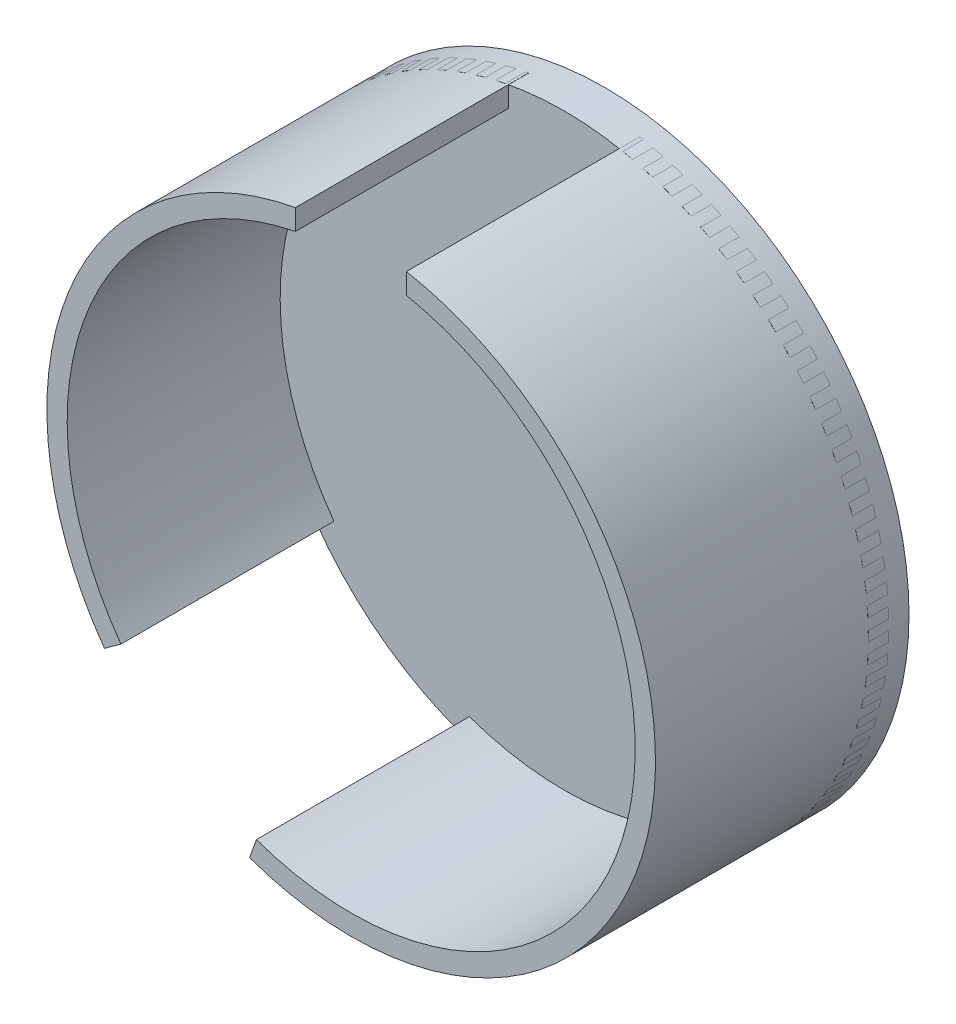
ISO-10303-21;
HEADER;
FILE_DESCRIPTION(('STEP AP214'),'2;1');
FILE_NAME('part.step','',(''),(''),'','','');
FILE_SCHEMA(('AUTOMOTIVE_DESIGN { 1 0 10303 214 1 1 1 1 }'));
ENDSEC;
DATA;
#1=APPLICATION_CONTEXT('core data for automotive mechanical design processes');
#2=APPLICATION_PROTOCOL_DEFINITION('international standard','automotive_design',2000,#1);
#3=PRODUCT_CONTEXT('',#1,'mechanical');
#4=PRODUCT('Part','Part','',(#3));
#5=PRODUCT_RELATED_PRODUCT_CATEGORY('part','',(#4));
#6=PRODUCT_DEFINITION_FORMATION('','',#4);
#7=PRODUCT_DEFINITION_CONTEXT('part definition',#1,'design');
#8=PRODUCT_DEFINITION('design','',#6,#7);
#9=PRODUCT_DEFINITION_SHAPE('','',#8);
#10=(LENGTH_UNIT() NAMED_UNIT(*) SI_UNIT(.MILLI.,.METRE.));
#11=(NAMED_UNIT(*) PLANE_ANGLE_UNIT() SI_UNIT($,.RADIAN.));
#12=(NAMED_UNIT(*) SI_UNIT($,.STERADIAN.) SOLID_ANGLE_UNIT());
#13=UNCERTAINTY_MEASURE_WITH_UNIT(LENGTH_MEASURE(1.E-05),#10,'distance_accuracy_value','');
#14=(GEOMETRIC_REPRESENTATION_CONTEXT(3) GLOBAL_UNCERTAINTY_ASSIGNED_CONTEXT((#13)) GLOBAL_UNIT_ASSIGNED_CONTEXT((#10,
#11,#12)) REPRESENTATION_CONTEXT('',''));
#15=CARTESIAN_POINT('',(0.,0.,0.));
#16=DIRECTION('',(0.,0.,1.));
#17=DIRECTION('',(1.,0.,0.));
#18=AXIS2_PLACEMENT_3D('',#15,#16,#17);
#19=CARTESIAN_POINT('',(-32.9682085133082,83.708055005863,37.0037453271887));
#20=DIRECTION('',(0.,0.,-1.));
#21=DIRECTION('',(-1.,0.,0.));
#22=AXIS2_PLACEMENT_3D('',#19,#20,#21);
#23=CYLINDRICAL_SURFACE('',#22,30.);
#24=CARTESIAN_POINT('',(-32.9682085133082,83.708055005863,37.0037453271887));
#25=DIRECTION('',(0.,0.,1.));
#26=DIRECTION('',(1.,0.,0.));
#27=AXIS2_PLACEMENT_3D('',#24,#25,#26);
#28=CIRCLE('',#27,30.);
#29=CARTESIAN_POINT('',(-2.9682085133082,83.708055005863,37.0037453271887));
#30=VERTEX_POINT('',#29);
#31=EDGE_CURVE('P0_E10',#30,#30,#28,.T.);
#32=ORIENTED_EDGE('',*,*,#31,.F.);
#33=EDGE_LOOP('',(#32));
#34=FACE_BOUND('',#33,.T.);
#35=CARTESIAN_POINT('',(-32.9682085133082,83.708055005863,33.002591514543));
#36=DIRECTION('',(0.,0.,1.));
#37=DIRECTION('',(1.,0.,0.));
#38=AXIS2_PLACEMENT_3D('',#35,#36,#37);
#39=CIRCLE('',#38,30.);
#40=CARTESIAN_POINT('',(-2.9682085133082,83.708055005863,33.002591514543));
#41=VERTEX_POINT('',#40);
#42=EDGE_CURVE('P0_E18',#41,#41,#39,.T.);
#43=ORIENTED_EDGE('',*,*,#42,.T.);
#44=EDGE_LOOP('',(#43));
#45=FACE_BOUND('',#44,.T.);
#46=ADVANCED_FACE('P0_F15',(#34,#45),#23,.T.);
#47=CARTESIAN_POINT('',(-32.9682085133082,83.708055005863,37.0037453271887));
#48=DIRECTION('',(0.,0.,1.));
#49=DIRECTION('',(1.,0.,0.));
#50=AXIS2_PLACEMENT_3D('',#47,#48,#49);
#51=PLANE('',#50);
#52=ORIENTED_EDGE('',*,*,#31,.T.);
#53=EDGE_LOOP('',(#52));
#54=FACE_BOUND('',#53,.T.);
#55=ADVANCED_FACE('P0_F30',(#54),#51,.T.);
#56=CARTESIAN_POINT('',(-32.9682085133082,83.708055005863,33.002591514543));
#57=DIRECTION('',(0.,0.,1.));
#58=DIRECTION('',(1.,0.,0.));
#59=AXIS2_PLACEMENT_3D('',#56,#57,#58);
#60=PLANE('',#59);
#61=ORIENTED_EDGE('',*,*,#42,.F.);
#62=EDGE_LOOP('',(#61));
#63=FACE_BOUND('',#62,.T.);
#64=ADVANCED_FACE('P0_F28',(#63),#60,.F.);
#65=CLOSED_SHELL('',(#46,#55,#64));
#66=MANIFOLD_SOLID_BREP('P0_B1',#65);
#67=CARTESIAN_POINT('',(-32.9682085133082,83.708055005863,58.002591514543));
#68=DIRECTION('',(0.,0.,-1.));
#69=DIRECTION('',(-1.,0.,0.));
#70=AXIS2_PLACEMENT_3D('',#67,#68,#69);
#71=CYLINDRICAL_SURFACE('',#70,28.);
#72=CARTESIAN_POINT('',(-32.9682085133082,83.708055005863,35.002591514543));
#73=DIRECTION('',(0.,0.,-1.));
#74=DIRECTION('',(1.,0.,0.));
#75=AXIS2_PLACEMENT_3D('',#72,#73,#74);
#76=CIRCLE('',#75,28.);
#77=CARTESIAN_POINT('',(-55.6726774433688,67.3218690370687,35.002591514543));
#78=VERTEX_POINT('',#77);
#79=CARTESIAN_POINT('',(-38.4682085133082,111.162562832448,35.002591514543));
#80=VERTEX_POINT('',#79);
#81=EDGE_CURVE('P1_E79',#78,#80,#76,.T.);
#82=ORIENTED_EDGE('',*,*,#81,.T.);
#83=DIRECTION('',(0.,0.,-1.));
#84=VECTOR('',#83,1.);
#85=CARTESIAN_POINT('',(-38.4682085133082,111.162562832448,58.002591514543));
#86=LINE('',#85,#84);
#87=CARTESIAN_POINT('',(-38.4682085133082,111.162562832448,58.002591514543));
#88=VERTEX_POINT('',#87);
#89=EDGE_CURVE('P1_E10',#88,#80,#86,.T.);
#90=ORIENTED_EDGE('',*,*,#89,.F.);
#91=CARTESIAN_POINT('',(-32.9682085133082,83.708055005863,58.002591514543));
#92=DIRECTION('',(0.,0.,-1.));
#93=DIRECTION('',(1.,0.,0.));
#94=AXIS2_PLACEMENT_3D('',#91,#92,#93);
#95=CIRCLE('',#94,28.);
#96=CARTESIAN_POINT('',(-55.6726774433688,67.3218690370687,58.002591514543));
#97=VERTEX_POINT('',#96);
#98=EDGE_CURVE('P1_E67',#97,#88,#95,.T.);
#99=ORIENTED_EDGE('',*,*,#98,.F.);
#100=DIRECTION('',(0.,0.,-1.));
#101=VECTOR('',#100,1.);
#102=CARTESIAN_POINT('',(-55.6726774433688,67.3218690370687,58.002591514543));
#103=LINE('',#102,#101);
#104=EDGE_CURVE('P1_E75',#97,#78,#103,.T.);
#105=ORIENTED_EDGE('',*,*,#104,.T.);
#106=EDGE_LOOP('',(#82,#90,#99,#105));
#107=FACE_BOUND('',#106,.T.);
#108=ADVANCED_FACE('P1_F16',(#107),#71,.F.);
#109=CARTESIAN_POINT('',(-38.4682085133082,113.19957921198,58.002591514543));
#110=DIRECTION('',(-1.,0.,0.));
#111=DIRECTION('',(0.,0.,1.));
#112=AXIS2_PLACEMENT_3D('',#109,#110,#111);
#113=PLANE('',#112);
#114=DIRECTION('',(0.,1.,0.));
#115=VECTOR('',#114,1.);
#116=CARTESIAN_POINT('',(-38.4682085133082,113.19957921198,35.002591514543));
#117=LINE('',#116,#115);
#118=CARTESIAN_POINT('',(-38.4682085133082,113.19957921198,35.002591514543));
#119=VERTEX_POINT('',#118);
#120=EDGE_CURVE('P1_E71',#80,#119,#117,.T.);
#121=ORIENTED_EDGE('',*,*,#120,.T.);
#122=DIRECTION('',(0.,0.,-1.));
#123=VECTOR('',#122,1.);
#124=CARTESIAN_POINT('',(-38.4682085133082,113.19957921198,58.002591514543));
#125=LINE('',#124,#123);
#126=CARTESIAN_POINT('',(-38.4682085133082,113.19957921198,58.002591514543));
#127=VERTEX_POINT('',#126);
#128=EDGE_CURVE('P1_E24',#127,#119,#125,.T.);
#129=ORIENTED_EDGE('',*,*,#128,.F.);
#130=DIRECTION('',(0.,1.,0.));
#131=VECTOR('',#130,1.);
#132=CARTESIAN_POINT('',(-38.4682085133082,113.19957921198,58.002591514543));
#133=LINE('',#132,#131);
#134=EDGE_CURVE('P1_E62',#88,#127,#133,.T.);
#135=ORIENTED_EDGE('',*,*,#134,.F.);
#136=ORIENTED_EDGE('',*,*,#89,.T.);
#137=EDGE_LOOP('',(#121,#129,#135,#136));
#138=FACE_BOUND('',#137,.T.);
#139=ADVANCED_FACE('P1_F70',(#138),#113,.F.);
#140=CARTESIAN_POINT('',(-32.9682085133082,83.708055005863,58.002591514543));
#141=DIRECTION('',(0.,0.,-1.));
#142=DIRECTION('',(-1.,0.,0.));
#143=AXIS2_PLACEMENT_3D('',#140,#141,#142);
#144=CYLINDRICAL_SURFACE('',#143,30.);
#145=CARTESIAN_POINT('',(-32.9682085133082,83.708055005863,35.002591514543));
#146=DIRECTION('',(0.,0.,1.));
#147=DIRECTION('',(1.,0.,0.));
#148=AXIS2_PLACEMENT_3D('',#145,#146,#147);
#149=CIRCLE('',#148,30.);
#150=CARTESIAN_POINT('',(-57.2944252240874,66.1514271821548,35.002591514543));
#151=VERTEX_POINT('',#150);
#152=EDGE_CURVE('P1_E49',#119,#151,#149,.T.);
#153=ORIENTED_EDGE('',*,*,#152,.T.);
#154=DIRECTION('',(0.,0.,-1.));
#155=VECTOR('',#154,1.);
#156=CARTESIAN_POINT('',(-57.2944252240874,66.1514271821548,58.002591514543));
#157=LINE('',#156,#155);
#158=CARTESIAN_POINT('',(-57.2944252240874,66.1514271821548,58.002591514543));
#159=VERTEX_POINT('',#158);
#160=EDGE_CURVE('P1_E72',#159,#151,#157,.T.);
#161=ORIENTED_EDGE('',*,*,#160,.F.);
#162=CARTESIAN_POINT('',(-32.9682085133082,83.708055005863,58.002591514543));
#163=DIRECTION('',(0.,0.,1.));
#164=DIRECTION('',(1.,0.,0.));
#165=AXIS2_PLACEMENT_3D('',#162,#163,#164);
#166=CIRCLE('',#165,30.);
#167=EDGE_CURVE('P1_E65',#127,#159,#166,.T.);
#168=ORIENTED_EDGE('',*,*,#167,.F.);
#169=ORIENTED_EDGE('',*,*,#128,.T.);
#170=EDGE_LOOP('',(#153,#161,#168,#169));
#171=FACE_BOUND('',#170,.T.);
#172=ADVANCED_FACE('P1_F73',(#171),#144,.T.);
#173=CARTESIAN_POINT('',(-57.2944252240874,66.1514271821548,58.002591514543));
#174=DIRECTION('',(-0.58522092745694,0.810873890359308,0.));
#175=DIRECTION('',(-0.810873890359308,-0.58522092745694,0.));
#176=AXIS2_PLACEMENT_3D('',#173,#174,#175);
#177=PLANE('',#176);
#178=DIRECTION('',(0.810873890359308,0.58522092745694,0.));
#179=VECTOR('',#178,1.);
#180=CARTESIAN_POINT('',(-57.2944252240874,66.1514271821548,35.002591514543));
#181=LINE('',#180,#179);
#182=EDGE_CURVE('P1_E55',#151,#78,#181,.T.);
#183=ORIENTED_EDGE('',*,*,#182,.T.);
#184=ORIENTED_EDGE('',*,*,#104,.F.);
#185=DIRECTION('',(0.810873890359308,0.58522092745694,0.));
#186=VECTOR('',#185,1.);
#187=CARTESIAN_POINT('',(-57.2944252240874,66.1514271821548,58.002591514543));
#188=LINE('',#187,#186);
#189=EDGE_CURVE('P1_E32',#159,#97,#188,.T.);
#190=ORIENTED_EDGE('',*,*,#189,.F.);
#191=ORIENTED_EDGE('',*,*,#160,.T.);
#192=EDGE_LOOP('',(#183,#184,#190,#191));
#193=FACE_BOUND('',#192,.T.);
#194=ADVANCED_FACE('P1_F86',(#193),#177,.F.);
#195=CARTESIAN_POINT('',(-32.9682085133082,83.708055005863,58.002591514543));
#196=DIRECTION('',(0.,0.,1.));
#197=DIRECTION('',(1.,0.,0.));
#198=AXIS2_PLACEMENT_3D('',#195,#196,#197);
#199=PLANE('',#198);
#200=ORIENTED_EDGE('',*,*,#98,.T.);
#201=ORIENTED_EDGE('',*,*,#134,.T.);
#202=ORIENTED_EDGE('',*,*,#167,.T.);
#203=ORIENTED_EDGE('',*,*,#189,.T.);
#204=EDGE_LOOP('',(#200,#201,#202,#203));
#205=FACE_BOUND('',#204,.T.);
#206=ADVANCED_FACE('P1_F63',(#205),#199,.T.);
#207=CARTESIAN_POINT('',(-32.9682085133082,83.708055005863,35.002591514543));
#208=DIRECTION('',(0.,0.,1.));
#209=DIRECTION('',(1.,0.,0.));
#210=AXIS2_PLACEMENT_3D('',#207,#208,#209);
#211=PLANE('',#210);
#212=ORIENTED_EDGE('',*,*,#81,.F.);
#213=ORIENTED_EDGE('',*,*,#182,.F.);
#214=ORIENTED_EDGE('',*,*,#152,.F.);
#215=ORIENTED_EDGE('',*,*,#120,.F.);
#216=EDGE_LOOP('',(#212,#213,#214,#215));
#217=FACE_BOUND('',#216,.T.);
#218=ADVANCED_FACE('P1_F89',(#217),#211,.F.);
#219=CLOSED_SHELL('',(#108,#139,#172,#194,#206,#218));
#220=MANIFOLD_SOLID_BREP('P1_B1',#219);
#221=CARTESIAN_POINT('',(-32.9682085133082,83.708055005863,58.002591514543));
#222=DIRECTION('',(0.,0.,-1.));
#223=DIRECTION('',(-1.,0.,0.));
#224=AXIS2_PLACEMENT_3D('',#221,#222,#223);
#225=CYLINDRICAL_SURFACE('',#224,28.);
#226=CARTESIAN_POINT('',(-32.9682085133082,83.708055005863,35.002591514543));
#227=DIRECTION('',(0.,0.,-1.));
#228=DIRECTION('',(1.,0.,0.));
#229=AXIS2_PLACEMENT_3D('',#226,#227,#228);
#230=CIRCLE('',#229,28.);
#231=CARTESIAN_POINT('',(-27.5282449084881,111.174521760403,35.002591514543));
#232=VERTEX_POINT('',#231);
#233=CARTESIAN_POINT('',(-42.3145871575244,57.3140176822753,35.002591514543));
#234=VERTEX_POINT('',#233);
#235=EDGE_CURVE('P2_E80',#232,#234,#230,.T.);
#236=ORIENTED_EDGE('',*,*,#235,.T.);
#237=DIRECTION('',(0.,0.,-1.));
#238=VECTOR('',#237,1.);
#239=CARTESIAN_POINT('',(-42.3145871575244,57.3140176822753,58.002591514543));
#240=LINE('',#239,#238);
#241=CARTESIAN_POINT('',(-42.3145871575244,57.3140176822753,58.002591514543));
#242=VERTEX_POINT('',#241);
#243=EDGE_CURVE('P2_E11',#242,#234,#240,.T.);
#244=ORIENTED_EDGE('',*,*,#243,.F.);
#245=CARTESIAN_POINT('',(-32.9682085133082,83.708055005863,58.002591514543));
#246=DIRECTION('',(0.,0.,-1.));
#247=DIRECTION('',(1.,0.,0.));
#248=AXIS2_PLACEMENT_3D('',#245,#246,#247);
#249=CIRCLE('',#248,28.);
#250=CARTESIAN_POINT('',(-27.5282449084881,111.174521760403,58.002591514543));
#251=VERTEX_POINT('',#250);
#252=EDGE_CURVE('P2_E68',#251,#242,#249,.T.);
#253=ORIENTED_EDGE('',*,*,#252,.F.);
#254=DIRECTION('',(0.,0.,-1.));
#255=VECTOR('',#254,1.);
#256=CARTESIAN_POINT('',(-27.5282449084881,111.174521760403,58.002591514543));
#257=LINE('',#256,#255);
#258=EDGE_CURVE('P2_E76',#251,#232,#257,.T.);
#259=ORIENTED_EDGE('',*,*,#258,.T.);
#260=EDGE_LOOP('',(#236,#244,#253,#259));
#261=FACE_BOUND('',#260,.T.);
#262=ADVANCED_FACE('P2_F17',(#261),#225,.F.);
#263=CARTESIAN_POINT('',(-42.3145871575244,57.3140176822753,58.002591514543));
#264=DIRECTION('',(0.942644190128132,-0.333799237293433,0.));
#265=DIRECTION('',(0.333799237293434,0.942644190128132,0.));
#266=AXIS2_PLACEMENT_3D('',#263,#264,#265);
#267=PLANE('',#266);
#268=DIRECTION('',(-0.333799237293434,-0.942644190128132,0.));
#269=VECTOR('',#268,1.);
#270=CARTESIAN_POINT('',(-42.3145871575244,57.3140176822753,35.002591514543));
#271=LINE('',#270,#269);
#272=CARTESIAN_POINT('',(-42.9821856321112,55.428729302019,35.002591514543));
#273=VERTEX_POINT('',#272);
#274=EDGE_CURVE('P2_E72',#234,#273,#271,.T.);
#275=ORIENTED_EDGE('',*,*,#274,.T.);
#276=DIRECTION('',(0.,0.,-1.));
#277=VECTOR('',#276,1.);
#278=CARTESIAN_POINT('',(-42.9821856321112,55.428729302019,58.002591514543));
#279=LINE('',#278,#277);
#280=CARTESIAN_POINT('',(-42.9821856321112,55.428729302019,58.002591514543));
#281=VERTEX_POINT('',#280);
#282=EDGE_CURVE('P2_E25',#281,#273,#279,.T.);
#283=ORIENTED_EDGE('',*,*,#282,.F.);
#284=DIRECTION('',(-0.333799237293434,-0.942644190128132,0.));
#285=VECTOR('',#284,1.);
#286=CARTESIAN_POINT('',(-42.3145871575244,57.3140176822753,58.002591514543));
#287=LINE('',#286,#285);
#288=EDGE_CURVE('P2_E63',#242,#281,#287,.T.);
#289=ORIENTED_EDGE('',*,*,#288,.F.);
#290=ORIENTED_EDGE('',*,*,#243,.T.);
#291=EDGE_LOOP('',(#275,#283,#289,#290));
#292=FACE_BOUND('',#291,.T.);
#293=ADVANCED_FACE('P2_F71',(#292),#267,.F.);
#294=CARTESIAN_POINT('',(-32.9682085133082,83.708055005863,58.002591514543));
#295=DIRECTION('',(0.,0.,-1.));
#296=DIRECTION('',(-1.,0.,0.));
#297=AXIS2_PLACEMENT_3D('',#294,#295,#296);
#298=CYLINDRICAL_SURFACE('',#297,30.);
#299=CARTESIAN_POINT('',(-32.9682085133082,83.708055005863,35.002591514543));
#300=DIRECTION('',(0.,0.,1.));
#301=DIRECTION('',(1.,0.,0.));
#302=AXIS2_PLACEMENT_3D('',#299,#300,#301);
#303=CIRCLE('',#302,30.);
#304=CARTESIAN_POINT('',(-27.5282449084881,113.210712445121,35.002591514543));
#305=VERTEX_POINT('',#304);
#306=EDGE_CURVE('P2_E50',#273,#305,#303,.T.);
#307=ORIENTED_EDGE('',*,*,#306,.T.);
#308=DIRECTION('',(0.,0.,-1.));
#309=VECTOR('',#308,1.);
#310=CARTESIAN_POINT('',(-27.5282449084881,113.210712445121,58.002591514543));
#311=LINE('',#310,#309);
#312=CARTESIAN_POINT('',(-27.5282449084881,113.210712445121,58.002591514543));
#313=VERTEX_POINT('',#312);
#314=EDGE_CURVE('P2_E73',#313,#305,#311,.T.);
#315=ORIENTED_EDGE('',*,*,#314,.F.);
#316=CARTESIAN_POINT('',(-32.9682085133082,83.708055005863,58.002591514543));
#317=DIRECTION('',(0.,0.,1.));
#318=DIRECTION('',(1.,0.,0.));
#319=AXIS2_PLACEMENT_3D('',#316,#317,#318);
#320=CIRCLE('',#319,30.);
#321=EDGE_CURVE('P2_E66',#281,#313,#320,.T.);
#322=ORIENTED_EDGE('',*,*,#321,.F.);
#323=ORIENTED_EDGE('',*,*,#282,.T.);
#324=EDGE_LOOP('',(#307,#315,#322,#323));
#325=FACE_BOUND('',#324,.T.);
#326=ADVANCED_FACE('P2_F74',(#325),#298,.T.);
#327=CARTESIAN_POINT('',(-27.5282449084881,111.174521760403,58.002591514543));
#328=DIRECTION('',(1.,0.,0.));
#329=DIRECTION('',(0.,0.,-1.));
#330=AXIS2_PLACEMENT_3D('',#327,#328,#329);
#331=PLANE('',#330);
#332=DIRECTION('',(0.,-1.,0.));
#333=VECTOR('',#332,1.);
#334=CARTESIAN_POINT('',(-27.5282449084881,111.174521760403,35.002591514543));
#335=LINE('',#334,#333);
#336=EDGE_CURVE('P2_E56',#305,#232,#335,.T.);
#337=ORIENTED_EDGE('',*,*,#336,.T.);
#338=ORIENTED_EDGE('',*,*,#258,.F.);
#339=DIRECTION('',(0.,-1.,0.));
#340=VECTOR('',#339,1.);
#341=CARTESIAN_POINT('',(-27.5282449084881,111.174521760403,58.002591514543));
#342=LINE('',#341,#340);
#343=EDGE_CURVE('P2_E33',#313,#251,#342,.T.);
#344=ORIENTED_EDGE('',*,*,#343,.F.);
#345=ORIENTED_EDGE('',*,*,#314,.T.);
#346=EDGE_LOOP('',(#337,#338,#344,#345));
#347=FACE_BOUND('',#346,.T.);
#348=ADVANCED_FACE('P2_F87',(#347),#331,.F.);
#349=CARTESIAN_POINT('',(-32.9682085133082,83.708055005863,58.002591514543));
#350=DIRECTION('',(0.,0.,1.));
#351=DIRECTION('',(1.,0.,0.));
#352=AXIS2_PLACEMENT_3D('',#349,#350,#351);
#353=PLANE('',#352);
#354=ORIENTED_EDGE('',*,*,#252,.T.);
#355=ORIENTED_EDGE('',*,*,#288,.T.);
#356=ORIENTED_EDGE('',*,*,#321,.T.);
#357=ORIENTED_EDGE('',*,*,#343,.T.);
#358=EDGE_LOOP('',(#354,#355,#356,#357));
#359=FACE_BOUND('',#358,.T.);
#360=ADVANCED_FACE('P2_F64',(#359),#353,.T.);
#361=CARTESIAN_POINT('',(-32.9682085133082,83.708055005863,35.002591514543));
#362=DIRECTION('',(0.,0.,1.));
#363=DIRECTION('',(1.,0.,0.));
#364=AXIS2_PLACEMENT_3D('',#361,#362,#363);
#365=PLANE('',#364);
#366=ORIENTED_EDGE('',*,*,#235,.F.);
#367=ORIENTED_EDGE('',*,*,#336,.F.);
#368=ORIENTED_EDGE('',*,*,#306,.F.);
#369=ORIENTED_EDGE('',*,*,#274,.F.);
#370=EDGE_LOOP('',(#366,#367,#368,#369));
#371=FACE_BOUND('',#370,.T.);
#372=ADVANCED_FACE('P2_F90',(#371),#365,.F.);
#373=CLOSED_SHELL('',(#262,#293,#326,#348,#360,#372));
#374=MANIFOLD_SOLID_BREP('P2_B1',#373);
#375=ADVANCED_BREP_SHAPE_REPRESENTATION('',(#18,#66,#220,#374),#14);
#376=SHAPE_DEFINITION_REPRESENTATION(#9,#375);
ENDSEC;
END-ISO-10303-21;
